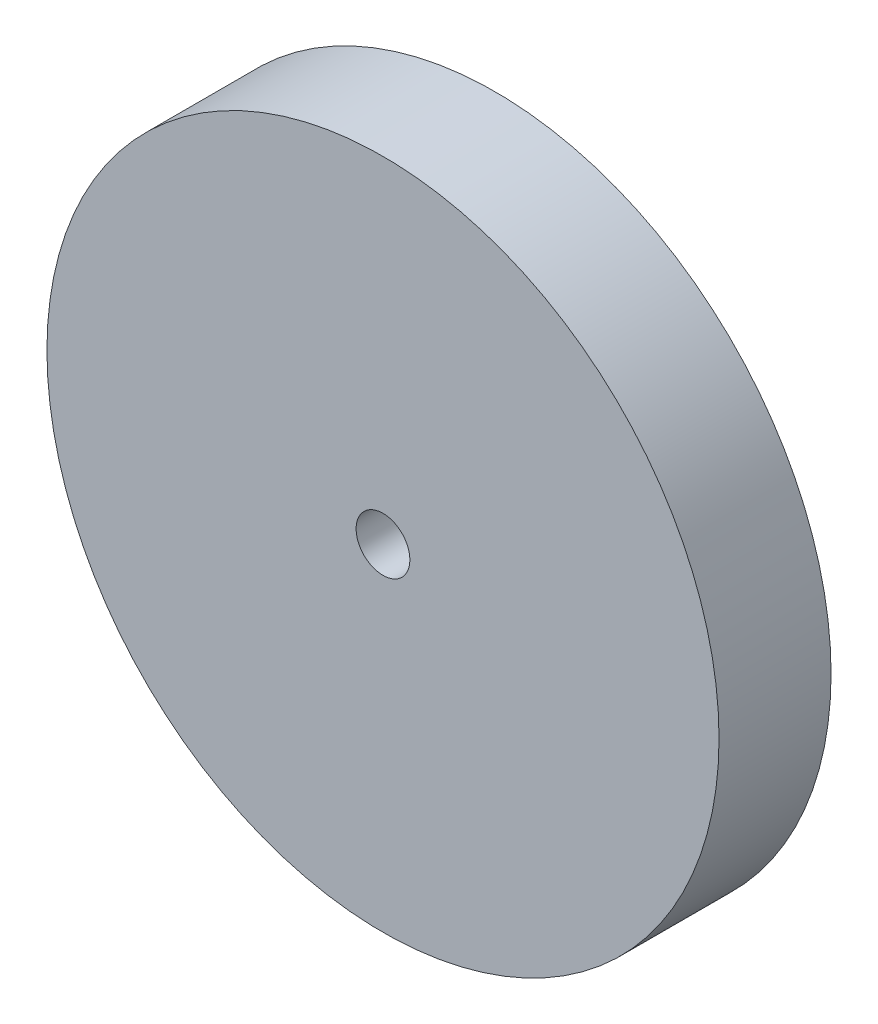
ISO-10303-21;
HEADER;
FILE_DESCRIPTION(('STEP AP214'),'2;1');
FILE_NAME('part.step','',(''),(''),'','','');
FILE_SCHEMA(('AUTOMOTIVE_DESIGN { 1 0 10303 214 1 1 1 1 }'));
ENDSEC;
DATA;
#1=APPLICATION_CONTEXT('core data for automotive mechanical design processes');
#2=APPLICATION_PROTOCOL_DEFINITION('international standard','automotive_design',2000,#1);
#3=PRODUCT_CONTEXT('',#1,'mechanical');
#4=PRODUCT('Part','Part','',(#3));
#5=PRODUCT_RELATED_PRODUCT_CATEGORY('part','',(#4));
#6=PRODUCT_DEFINITION_FORMATION('','',#4);
#7=PRODUCT_DEFINITION_CONTEXT('part definition',#1,'design');
#8=PRODUCT_DEFINITION('design','',#6,#7);
#9=PRODUCT_DEFINITION_SHAPE('','',#8);
#10=(LENGTH_UNIT() NAMED_UNIT(*) SI_UNIT(.MILLI.,.METRE.));
#11=(NAMED_UNIT(*) PLANE_ANGLE_UNIT() SI_UNIT($,.RADIAN.));
#12=(NAMED_UNIT(*) SI_UNIT($,.STERADIAN.) SOLID_ANGLE_UNIT());
#13=UNCERTAINTY_MEASURE_WITH_UNIT(LENGTH_MEASURE(1.E-05),#10,'distance_accuracy_value','');
#14=(GEOMETRIC_REPRESENTATION_CONTEXT(3) GLOBAL_UNCERTAINTY_ASSIGNED_CONTEXT((#13)) GLOBAL_UNIT_ASSIGNED_CONTEXT((#10,
#11,#12)) REPRESENTATION_CONTEXT('',''));
#15=CARTESIAN_POINT('',(0.,0.,0.));
#16=DIRECTION('',(0.,0.,1.));
#17=DIRECTION('',(1.,0.,0.));
#18=AXIS2_PLACEMENT_3D('',#15,#16,#17);
#19=CARTESIAN_POINT('',(0.,0.,5.));
#20=DIRECTION('',(0.,0.,1.));
#21=DIRECTION('',(1.,0.,0.));
#22=AXIS2_PLACEMENT_3D('',#19,#20,#21);
#23=PLANE('',#22);
#24=CARTESIAN_POINT('',(0.,0.,5.));
#25=DIRECTION('',(0.,0.,1.));
#26=DIRECTION('',(1.,0.,0.));
#27=AXIS2_PLACEMENT_3D('',#24,#25,#26);
#28=CIRCLE('',#27,15.);
#29=CARTESIAN_POINT('',(15.,0.,5.));
#30=VERTEX_POINT('',#29);
#31=EDGE_CURVE('E11',#30,#30,#28,.T.);
#32=ORIENTED_EDGE('',*,*,#31,.T.);
#33=EDGE_LOOP('',(#32));
#34=FACE_BOUND('',#33,.T.);
#35=CARTESIAN_POINT('',(0.,0.,5.));
#36=DIRECTION('',(0.,0.,1.));
#37=DIRECTION('',(1.,0.,0.));
#38=AXIS2_PLACEMENT_3D('',#35,#36,#37);
#39=CIRCLE('',#38,1.2);
#40=CARTESIAN_POINT('',(1.2,0.,5.));
#41=VERTEX_POINT('',#40);
#42=EDGE_CURVE('E42',#41,#41,#39,.T.);
#43=ORIENTED_EDGE('',*,*,#42,.F.);
#44=EDGE_LOOP('',(#43));
#45=FACE_BOUND('',#44,.T.);
#46=ADVANCED_FACE('F31',(#34,#45),#23,.T.);
#47=CARTESIAN_POINT('',(0.,0.,0.));
#48=DIRECTION('',(0.,0.,1.));
#49=DIRECTION('',(1.,0.,0.));
#50=AXIS2_PLACEMENT_3D('',#47,#48,#49);
#51=PLANE('',#50);
#52=CARTESIAN_POINT('',(0.,0.,0.));
#53=DIRECTION('',(0.,0.,1.));
#54=DIRECTION('',(1.,0.,0.));
#55=AXIS2_PLACEMENT_3D('',#52,#53,#54);
#56=CIRCLE('',#55,15.);
#57=CARTESIAN_POINT('',(15.,0.,0.));
#58=VERTEX_POINT('',#57);
#59=EDGE_CURVE('E35',#58,#58,#56,.T.);
#60=ORIENTED_EDGE('',*,*,#59,.F.);
#61=EDGE_LOOP('',(#60));
#62=FACE_BOUND('',#61,.T.);
#63=CARTESIAN_POINT('',(0.,0.,0.));
#64=DIRECTION('',(0.,0.,1.));
#65=DIRECTION('',(1.,0.,0.));
#66=AXIS2_PLACEMENT_3D('',#63,#64,#65);
#67=CIRCLE('',#66,1.2);
#68=CARTESIAN_POINT('',(1.2,0.,0.));
#69=VERTEX_POINT('',#68);
#70=EDGE_CURVE('E45',#69,#69,#67,.T.);
#71=ORIENTED_EDGE('',*,*,#70,.T.);
#72=EDGE_LOOP('',(#71));
#73=FACE_BOUND('',#72,.T.);
#74=ADVANCED_FACE('F55',(#62,#73),#51,.F.);
#75=CARTESIAN_POINT('',(0.,0.,5.));
#76=DIRECTION('',(0.,0.,-1.));
#77=DIRECTION('',(-1.,0.,0.));
#78=AXIS2_PLACEMENT_3D('',#75,#76,#77);
#79=CYLINDRICAL_SURFACE('',#78,15.);
#80=ORIENTED_EDGE('',*,*,#31,.F.);
#81=EDGE_LOOP('',(#80));
#82=FACE_BOUND('',#81,.T.);
#83=ORIENTED_EDGE('',*,*,#59,.T.);
#84=EDGE_LOOP('',(#83));
#85=FACE_BOUND('',#84,.T.);
#86=ADVANCED_FACE('F33',(#82,#85),#79,.T.);
#87=CARTESIAN_POINT('',(0.,0.,5.));
#88=DIRECTION('',(0.,0.,-1.));
#89=DIRECTION('',(-1.,0.,0.));
#90=AXIS2_PLACEMENT_3D('',#87,#88,#89);
#91=CYLINDRICAL_SURFACE('',#90,1.2);
#92=ORIENTED_EDGE('',*,*,#42,.T.);
#93=EDGE_LOOP('',(#92));
#94=FACE_BOUND('',#93,.T.);
#95=ORIENTED_EDGE('',*,*,#70,.F.);
#96=EDGE_LOOP('',(#95));
#97=FACE_BOUND('',#96,.T.);
#98=ADVANCED_FACE('F51',(#94,#97),#91,.F.);
#99=CLOSED_SHELL('',(#46,#74,#86,#98));
#100=MANIFOLD_SOLID_BREP('B2',#99);
#101=ADVANCED_BREP_SHAPE_REPRESENTATION('',(#18,#100),#14);
#102=SHAPE_DEFINITION_REPRESENTATION(#9,#101);
ENDSEC;
END-ISO-10303-21;
